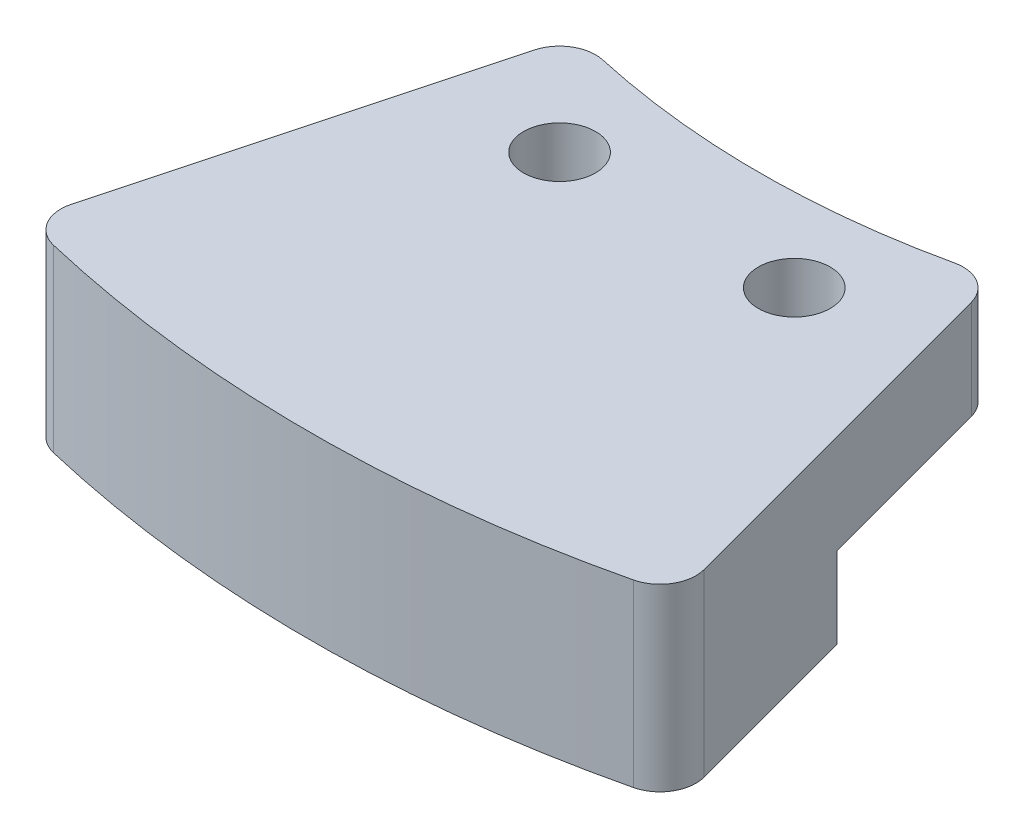
ISO-10303-21;
HEADER;
FILE_DESCRIPTION(('STEP AP214'),'2;1');
FILE_NAME('part.step','',(''),(''),'','','');
FILE_SCHEMA(('AUTOMOTIVE_DESIGN { 1 0 10303 214 1 1 1 1 }'));
ENDSEC;
DATA;
#1=APPLICATION_CONTEXT('core data for automotive mechanical design processes');
#2=APPLICATION_PROTOCOL_DEFINITION('international standard','automotive_design',2000,#1);
#3=PRODUCT_CONTEXT('',#1,'mechanical');
#4=PRODUCT('Part','Part','',(#3));
#5=PRODUCT_RELATED_PRODUCT_CATEGORY('part','',(#4));
#6=PRODUCT_DEFINITION_FORMATION('','',#4);
#7=PRODUCT_DEFINITION_CONTEXT('part definition',#1,'design');
#8=PRODUCT_DEFINITION('design','',#6,#7);
#9=PRODUCT_DEFINITION_SHAPE('','',#8);
#10=(LENGTH_UNIT() NAMED_UNIT(*) SI_UNIT(.MILLI.,.METRE.));
#11=(NAMED_UNIT(*) PLANE_ANGLE_UNIT() SI_UNIT($,.RADIAN.));
#12=(NAMED_UNIT(*) SI_UNIT($,.STERADIAN.) SOLID_ANGLE_UNIT());
#13=UNCERTAINTY_MEASURE_WITH_UNIT(LENGTH_MEASURE(1.E-05),#10,'distance_accuracy_value','');
#14=(GEOMETRIC_REPRESENTATION_CONTEXT(3) GLOBAL_UNCERTAINTY_ASSIGNED_CONTEXT((#13)) GLOBAL_UNIT_ASSIGNED_CONTEXT((#10,
#11,#12)) REPRESENTATION_CONTEXT('',''));
#15=CARTESIAN_POINT('',(0.,0.,0.));
#16=DIRECTION('',(0.,0.,1.));
#17=DIRECTION('',(1.,0.,0.));
#18=AXIS2_PLACEMENT_3D('',#15,#16,#17);
#19=CARTESIAN_POINT('',(0.,10.,0.));
#20=DIRECTION('',(0.,-1.,0.));
#21=DIRECTION('',(0.,0.,-1.));
#22=AXIS2_PLACEMENT_3D('',#19,#20,#21);
#23=CYLINDRICAL_SURFACE('',#22,45.);
#24=CARTESIAN_POINT('',(0.,4.5,0.));
#25=DIRECTION('',(0.,1.,0.));
#26=DIRECTION('',(0.,0.,-1.));
#27=AXIS2_PLACEMENT_3D('',#24,#25,#26);
#28=CIRCLE('',#27,45.);
#29=CARTESIAN_POINT('',(-9.78666213883321,4.5,43.9229011357439));
#30=VERTEX_POINT('',#29);
#31=CARTESIAN_POINT('',(9.78666213883322,4.5,43.9229011357439));
#32=VERTEX_POINT('',#31);
#33=EDGE_CURVE('E121',#30,#32,#28,.T.);
#34=ORIENTED_EDGE('',*,*,#33,.F.);
#35=DIRECTION('',(0.,-1.,0.));
#36=VECTOR('',#35,1.);
#37=CARTESIAN_POINT('',(-9.78666213883321,10.,43.9229011357439));
#38=LINE('',#37,#36);
#39=CARTESIAN_POINT('',(-9.78666213883321,10.,43.9229011357439));
#40=VERTEX_POINT('',#39);
#41=EDGE_CURVE('E182',#30,#40,#38,.F.);
#42=ORIENTED_EDGE('',*,*,#41,.T.);
#43=CARTESIAN_POINT('',(0.,10.,0.));
#44=DIRECTION('',(0.,-1.,0.));
#45=DIRECTION('',(0.,0.,1.));
#46=AXIS2_PLACEMENT_3D('',#43,#44,#45);
#47=CIRCLE('',#46,45.);
#48=CARTESIAN_POINT('',(9.78666213883322,10.,43.9229011357439));
#49=VERTEX_POINT('',#48);
#50=EDGE_CURVE('E159',#49,#40,#47,.T.);
#51=ORIENTED_EDGE('',*,*,#50,.F.);
#52=DIRECTION('',(0.,-1.,0.));
#53=VECTOR('',#52,1.);
#54=CARTESIAN_POINT('',(9.78666213883322,10.,43.9229011357439));
#55=LINE('',#54,#53);
#56=EDGE_CURVE('E179',#49,#32,#55,.T.);
#57=ORIENTED_EDGE('',*,*,#56,.T.);
#58=EDGE_LOOP('',(#34,#42,#51,#57));
#59=FACE_BOUND('',#58,.T.);
#60=ADVANCED_FACE('F33',(#59),#23,.F.);
#61=CARTESIAN_POINT('',(-6.52630961100259,10.,49.5722430686905));
#62=DIRECTION('',(0.,-1.,0.));
#63=DIRECTION('',(0.,0.,-1.));
#64=AXIS2_PLACEMENT_3D('',#61,#62,#63);
#65=CYLINDRICAL_SURFACE('',#64,2.);
#66=CARTESIAN_POINT('',(-6.52630961100259,10.,49.5722430686905));
#67=DIRECTION('',(0.,1.,0.));
#68=DIRECTION('',(0.,0.,1.));
#69=AXIS2_PLACEMENT_3D('',#66,#67,#68);
#70=CIRCLE('',#69,2.);
#71=CARTESIAN_POINT('',(-6.52630961100259,10.,51.5722430686905));
#72=VERTEX_POINT('',#71);
#73=EDGE_CURVE('E148',#72,#72,#70,.T.);
#74=ORIENTED_EDGE('',*,*,#73,.T.);
#75=EDGE_LOOP('',(#74));
#76=FACE_BOUND('',#75,.T.);
#77=CARTESIAN_POINT('',(-6.52630961100259,4.5,49.5722430686905));
#78=DIRECTION('',(0.,-1.,0.));
#79=DIRECTION('',(0.,0.,-1.));
#80=AXIS2_PLACEMENT_3D('',#77,#78,#79);
#81=CIRCLE('',#80,2.);
#82=CARTESIAN_POINT('',(-6.52630961100259,4.5,47.5722430686905));
#83=VERTEX_POINT('',#82);
#84=EDGE_CURVE('E142',#83,#83,#81,.T.);
#85=ORIENTED_EDGE('',*,*,#84,.T.);
#86=EDGE_LOOP('',(#85));
#87=FACE_BOUND('',#86,.T.);
#88=ADVANCED_FACE('F236',(#76,#87),#65,.F.);
#89=CARTESIAN_POINT('',(6.5263096110026,10.,49.5722430686905));
#90=DIRECTION('',(0.,-1.,0.));
#91=DIRECTION('',(0.,0.,-1.));
#92=AXIS2_PLACEMENT_3D('',#89,#90,#91);
#93=CYLINDRICAL_SURFACE('',#92,2.);
#94=CARTESIAN_POINT('',(6.5263096110026,10.,49.5722430686905));
#95=DIRECTION('',(0.,1.,0.));
#96=DIRECTION('',(0.,0.,-1.));
#97=AXIS2_PLACEMENT_3D('',#94,#95,#96);
#98=CIRCLE('',#97,2.);
#99=CARTESIAN_POINT('',(6.5263096110026,10.,47.5722430686905));
#100=VERTEX_POINT('',#99);
#101=EDGE_CURVE('E145',#100,#100,#98,.T.);
#102=ORIENTED_EDGE('',*,*,#101,.T.);
#103=EDGE_LOOP('',(#102));
#104=FACE_BOUND('',#103,.T.);
#105=CARTESIAN_POINT('',(6.5263096110026,4.5,49.5722430686905));
#106=DIRECTION('',(0.,-1.,0.));
#107=DIRECTION('',(0.,0.,-1.));
#108=AXIS2_PLACEMENT_3D('',#105,#106,#107);
#109=CIRCLE('',#108,2.);
#110=CARTESIAN_POINT('',(6.5263096110026,4.5,47.5722430686905));
#111=VERTEX_POINT('',#110);
#112=EDGE_CURVE('E137',#111,#111,#109,.T.);
#113=ORIENTED_EDGE('',*,*,#112,.T.);
#114=EDGE_LOOP('',(#113));
#115=FACE_BOUND('',#114,.T.);
#116=ADVANCED_FACE('F241',(#104,#115),#93,.F.);
#117=CARTESIAN_POINT('',(0.,10.,0.));
#118=DIRECTION('',(0.,1.,0.));
#119=DIRECTION('',(0.,0.,1.));
#120=AXIS2_PLACEMENT_3D('',#117,#118,#119);
#121=PLANE('',#120);
#122=ORIENTED_EDGE('',*,*,#73,.F.);
#123=EDGE_LOOP('',(#122));
#124=FACE_BOUND('',#123,.T.);
#125=ORIENTED_EDGE('',*,*,#50,.T.);
#126=CARTESIAN_POINT('',(-10.2216249005591,10.,45.8750300751103));
#127=DIRECTION('',(0.,1.,0.));
#128=DIRECTION('',(0.,0.,1.));
#129=AXIS2_PLACEMENT_3D('',#126,#127,#128);
#130=CIRCLE('',#129,2.);
#131=CARTESIAN_POINT('',(-12.1534765531373,10.,45.3573919849052));
#132=VERTEX_POINT('',#131);
#133=EDGE_CURVE('E190',#40,#132,#130,.T.);
#134=ORIENTED_EDGE('',*,*,#133,.T.);
#135=DIRECTION('',(-0.258819045102522,0.,0.965925826289068));
#136=VECTOR('',#135,1.);
#137=CARTESIAN_POINT('',(-11.6468570296135,10.,43.4666621830081));
#138=LINE('',#137,#136);
#139=CARTESIAN_POINT('',(-17.5920810951391,10.,65.6545404579307));
#140=VERTEX_POINT('',#139);
#141=EDGE_CURVE('E162',#132,#140,#138,.T.);
#142=ORIENTED_EDGE('',*,*,#141,.T.);
#143=CARTESIAN_POINT('',(-15.6602294425609,10.,66.1721785481357));
#144=DIRECTION('',(0.,1.,0.));
#145=DIRECTION('',(0.,0.,1.));
#146=AXIS2_PLACEMENT_3D('',#143,#144,#145);
#147=CIRCLE('',#146,2.);
#148=CARTESIAN_POINT('',(-16.1208244261656,10.,68.1184190936691));
#149=VERTEX_POINT('',#148);
#150=EDGE_CURVE('E184',#140,#149,#147,.T.);
#151=ORIENTED_EDGE('',*,*,#150,.T.);
#152=CARTESIAN_POINT('',(0.,10.,0.));
#153=DIRECTION('',(0.,1.,0.));
#154=DIRECTION('',(0.,0.,1.));
#155=AXIS2_PLACEMENT_3D('',#152,#153,#154);
#156=CIRCLE('',#155,70.);
#157=CARTESIAN_POINT('',(16.1208244261657,10.,68.1184190936691));
#158=VERTEX_POINT('',#157);
#159=EDGE_CURVE('E152',#149,#158,#156,.T.);
#160=ORIENTED_EDGE('',*,*,#159,.T.);
#161=CARTESIAN_POINT('',(15.6602294425609,10.,66.1721785481357));
#162=DIRECTION('',(0.,1.,0.));
#163=DIRECTION('',(0.,0.,1.));
#164=AXIS2_PLACEMENT_3D('',#161,#162,#163);
#165=CIRCLE('',#164,2.);
#166=CARTESIAN_POINT('',(17.5920810951391,10.,65.6545404579307));
#167=VERTEX_POINT('',#166);
#168=EDGE_CURVE('E186',#158,#167,#165,.T.);
#169=ORIENTED_EDGE('',*,*,#168,.T.);
#170=DIRECTION('',(-0.258819045102522,0.,-0.965925826289068));
#171=VECTOR('',#170,1.);
#172=CARTESIAN_POINT('',(11.6468570296135,10.,43.4666621830081));
#173=LINE('',#172,#171);
#174=CARTESIAN_POINT('',(12.1534765531373,10.,45.3573919849052));
#175=VERTEX_POINT('',#174);
#176=EDGE_CURVE('E155',#167,#175,#173,.T.);
#177=ORIENTED_EDGE('',*,*,#176,.T.);
#178=CARTESIAN_POINT('',(10.2216249005591,10.,45.8750300751103));
#179=DIRECTION('',(0.,1.,0.));
#180=DIRECTION('',(0.,0.,1.));
#181=AXIS2_PLACEMENT_3D('',#178,#179,#180);
#182=CIRCLE('',#181,2.);
#183=EDGE_CURVE('E188',#175,#49,#182,.T.);
#184=ORIENTED_EDGE('',*,*,#183,.T.);
#185=EDGE_LOOP('',(#125,#134,#142,#151,#160,#169,#177,#184));
#186=FACE_BOUND('',#185,.T.);
#187=ORIENTED_EDGE('',*,*,#101,.F.);
#188=EDGE_LOOP('',(#187));
#189=FACE_BOUND('',#188,.T.);
#190=ADVANCED_FACE('F208',(#124,#186,#189),#121,.T.);
#191=CARTESIAN_POINT('',(0.,0.,0.));
#192=DIRECTION('',(0.,1.,0.));
#193=DIRECTION('',(0.,0.,1.));
#194=AXIS2_PLACEMENT_3D('',#191,#192,#193);
#195=PLANE('',#194);
#196=DIRECTION('',(-0.258819045102522,0.,-0.965925826289068));
#197=VECTOR('',#196,1.);
#198=CARTESIAN_POINT('',(11.6468570296135,0.,43.4666621830081));
#199=LINE('',#198,#197);
#200=CARTESIAN_POINT('',(17.5920810951391,0.,65.6545404579307));
#201=VERTEX_POINT('',#200);
#202=CARTESIAN_POINT('',(14.882095093395,0.,55.5407350116214));
#203=VERTEX_POINT('',#202);
#204=EDGE_CURVE('E135',#201,#203,#199,.T.);
#205=ORIENTED_EDGE('',*,*,#204,.F.);
#206=CARTESIAN_POINT('',(15.6602294425609,0.,66.1721785481357));
#207=DIRECTION('',(0.,1.,0.));
#208=DIRECTION('',(0.,0.,1.));
#209=AXIS2_PLACEMENT_3D('',#206,#207,#208);
#210=CIRCLE('',#209,2.);
#211=CARTESIAN_POINT('',(16.1208244261657,0.,68.1184190936691));
#212=VERTEX_POINT('',#211);
#213=EDGE_CURVE('E48',#201,#212,#210,.F.);
#214=ORIENTED_EDGE('',*,*,#213,.T.);
#215=CARTESIAN_POINT('',(0.,0.,0.));
#216=DIRECTION('',(0.,1.,0.));
#217=DIRECTION('',(0.,0.,1.));
#218=AXIS2_PLACEMENT_3D('',#215,#216,#217);
#219=CIRCLE('',#218,70.);
#220=CARTESIAN_POINT('',(-16.1208244261656,0.,68.1184190936691));
#221=VERTEX_POINT('',#220);
#222=EDGE_CURVE('E151',#221,#212,#219,.T.);
#223=ORIENTED_EDGE('',*,*,#222,.F.);
#224=CARTESIAN_POINT('',(-15.6602294425609,0.,66.1721785481357));
#225=DIRECTION('',(0.,1.,0.));
#226=DIRECTION('',(0.,0.,1.));
#227=AXIS2_PLACEMENT_3D('',#224,#225,#226);
#228=CIRCLE('',#227,2.);
#229=CARTESIAN_POINT('',(-17.5920810951391,0.,65.6545404579307));
#230=VERTEX_POINT('',#229);
#231=EDGE_CURVE('E56',#221,#230,#228,.F.);
#232=ORIENTED_EDGE('',*,*,#231,.T.);
#233=DIRECTION('',(-0.258819045102522,0.,0.965925826289068));
#234=VECTOR('',#233,1.);
#235=CARTESIAN_POINT('',(-11.6468570296135,0.,43.4666621830081));
#236=LINE('',#235,#234);
#237=CARTESIAN_POINT('',(-14.882095093395,0.,55.5407350116214));
#238=VERTEX_POINT('',#237);
#239=EDGE_CURVE('E156',#238,#230,#236,.T.);
#240=ORIENTED_EDGE('',*,*,#239,.F.);
#241=CARTESIAN_POINT('',(0.,0.,0.));
#242=DIRECTION('',(0.,-1.,0.));
#243=DIRECTION('',(0.,0.,-1.));
#244=AXIS2_PLACEMENT_3D('',#241,#242,#243);
#245=CIRCLE('',#244,57.5);
#246=EDGE_CURVE('E220',#203,#238,#245,.T.);
#247=ORIENTED_EDGE('',*,*,#246,.F.);
#248=EDGE_LOOP('',(#205,#214,#223,#232,#240,#247));
#249=FACE_BOUND('',#248,.T.);
#250=ADVANCED_FACE('F202',(#249),#195,.F.);
#251=CARTESIAN_POINT('',(0.,10.,0.));
#252=DIRECTION('',(0.,-1.,0.));
#253=DIRECTION('',(0.,0.,-1.));
#254=AXIS2_PLACEMENT_3D('',#251,#252,#253);
#255=CYLINDRICAL_SURFACE('',#254,70.);
#256=ORIENTED_EDGE('',*,*,#222,.T.);
#257=DIRECTION('',(0.,-1.,0.));
#258=VECTOR('',#257,1.);
#259=CARTESIAN_POINT('',(16.1208244261657,10.,68.1184190936691));
#260=LINE('',#259,#258);
#261=EDGE_CURVE('E11',#212,#158,#260,.F.);
#262=ORIENTED_EDGE('',*,*,#261,.T.);
#263=ORIENTED_EDGE('',*,*,#159,.F.);
#264=DIRECTION('',(0.,-1.,0.));
#265=VECTOR('',#264,1.);
#266=CARTESIAN_POINT('',(-16.1208244261656,10.,68.1184190936691));
#267=LINE('',#266,#265);
#268=EDGE_CURVE('E41',#149,#221,#267,.T.);
#269=ORIENTED_EDGE('',*,*,#268,.T.);
#270=EDGE_LOOP('',(#256,#262,#263,#269));
#271=FACE_BOUND('',#270,.T.);
#272=ADVANCED_FACE('F199',(#271),#255,.T.);
#273=CARTESIAN_POINT('',(11.6468570296135,10.,43.4666621830081));
#274=DIRECTION('',(-0.965925826289068,0.,0.258819045102522));
#275=DIRECTION('',(0.258819045102522,0.,0.965925826289068));
#276=AXIS2_PLACEMENT_3D('',#273,#274,#275);
#277=PLANE('',#276);
#278=DIRECTION('',(0.258819045102522,0.,0.965925826289068));
#279=VECTOR('',#278,1.);
#280=CARTESIAN_POINT('',(14.882095093395,4.5,55.5407350116214));
#281=LINE('',#280,#279);
#282=CARTESIAN_POINT('',(12.1534765531373,4.5,45.3573919849052));
#283=VERTEX_POINT('',#282);
#284=CARTESIAN_POINT('',(14.882095093395,4.5,55.5407350116214));
#285=VERTEX_POINT('',#284);
#286=EDGE_CURVE('E110',#283,#285,#281,.T.);
#287=ORIENTED_EDGE('',*,*,#286,.F.);
#288=DIRECTION('',(0.,-1.,0.));
#289=VECTOR('',#288,1.);
#290=CARTESIAN_POINT('',(12.1534765531373,10.,45.3573919849052));
#291=LINE('',#290,#289);
#292=EDGE_CURVE('E194',#283,#175,#291,.F.);
#293=ORIENTED_EDGE('',*,*,#292,.T.);
#294=ORIENTED_EDGE('',*,*,#176,.F.);
#295=DIRECTION('',(0.,-1.,0.));
#296=VECTOR('',#295,1.);
#297=CARTESIAN_POINT('',(17.5920810951391,10.,65.6545404579307));
#298=LINE('',#297,#296);
#299=EDGE_CURVE('E192',#167,#201,#298,.T.);
#300=ORIENTED_EDGE('',*,*,#299,.T.);
#301=ORIENTED_EDGE('',*,*,#204,.T.);
#302=DIRECTION('',(0.,-1.,0.));
#303=VECTOR('',#302,1.);
#304=CARTESIAN_POINT('',(14.882095093395,4.5,55.5407350116214));
#305=LINE('',#304,#303);
#306=EDGE_CURVE('E126',#285,#203,#305,.T.);
#307=ORIENTED_EDGE('',*,*,#306,.F.);
#308=EDGE_LOOP('',(#287,#293,#294,#300,#301,#307));
#309=FACE_BOUND('',#308,.T.);
#310=ADVANCED_FACE('F133',(#309),#277,.F.);
#311=CARTESIAN_POINT('',(-11.6468570296135,10.,43.4666621830081));
#312=DIRECTION('',(0.965925826289068,0.,0.258819045102522));
#313=DIRECTION('',(0.258819045102522,0.,-0.965925826289068));
#314=AXIS2_PLACEMENT_3D('',#311,#312,#313);
#315=PLANE('',#314);
#316=ORIENTED_EDGE('',*,*,#141,.F.);
#317=DIRECTION('',(0.,-1.,0.));
#318=VECTOR('',#317,1.);
#319=CARTESIAN_POINT('',(-12.1534765531373,10.,45.3573919849052));
#320=LINE('',#319,#318);
#321=CARTESIAN_POINT('',(-12.1534765531373,4.5,45.3573919849052));
#322=VERTEX_POINT('',#321);
#323=EDGE_CURVE('E173',#132,#322,#320,.T.);
#324=ORIENTED_EDGE('',*,*,#323,.T.);
#325=DIRECTION('',(0.258819045102521,0.,-0.965925826289068));
#326=VECTOR('',#325,1.);
#327=CARTESIAN_POINT('',(-11.6468570296135,4.5,43.4666621830081));
#328=LINE('',#327,#326);
#329=CARTESIAN_POINT('',(-14.882095093395,4.5,55.5407350116214));
#330=VERTEX_POINT('',#329);
#331=EDGE_CURVE('E131',#330,#322,#328,.T.);
#332=ORIENTED_EDGE('',*,*,#331,.F.);
#333=DIRECTION('',(0.,-1.,0.));
#334=VECTOR('',#333,1.);
#335=CARTESIAN_POINT('',(-14.882095093395,4.5,55.5407350116214));
#336=LINE('',#335,#334);
#337=EDGE_CURVE('E129',#330,#238,#336,.T.);
#338=ORIENTED_EDGE('',*,*,#337,.T.);
#339=ORIENTED_EDGE('',*,*,#239,.T.);
#340=DIRECTION('',(0.,-1.,0.));
#341=VECTOR('',#340,1.);
#342=CARTESIAN_POINT('',(-17.5920810951391,10.,65.6545404579307));
#343=LINE('',#342,#341);
#344=EDGE_CURVE('E165',#230,#140,#343,.F.);
#345=ORIENTED_EDGE('',*,*,#344,.T.);
#346=EDGE_LOOP('',(#316,#324,#332,#338,#339,#345));
#347=FACE_BOUND('',#346,.T.);
#348=ADVANCED_FACE('F206',(#347),#315,.F.);
#349=CARTESIAN_POINT('',(0.,4.5,0.));
#350=DIRECTION('',(0.,-1.,0.));
#351=DIRECTION('',(0.,0.,-1.));
#352=AXIS2_PLACEMENT_3D('',#349,#350,#351);
#353=CYLINDRICAL_SURFACE('',#352,57.5);
#354=ORIENTED_EDGE('',*,*,#246,.T.);
#355=ORIENTED_EDGE('',*,*,#337,.F.);
#356=CARTESIAN_POINT('',(0.,4.5,0.));
#357=DIRECTION('',(0.,-1.,0.));
#358=DIRECTION('',(0.,0.,-1.));
#359=AXIS2_PLACEMENT_3D('',#356,#357,#358);
#360=CIRCLE('',#359,57.5);
#361=EDGE_CURVE('E114',#285,#330,#360,.T.);
#362=ORIENTED_EDGE('',*,*,#361,.F.);
#363=ORIENTED_EDGE('',*,*,#306,.T.);
#364=EDGE_LOOP('',(#354,#355,#362,#363));
#365=FACE_BOUND('',#364,.T.);
#366=ADVANCED_FACE('F125',(#365),#353,.F.);
#367=CARTESIAN_POINT('',(0.,4.5,0.));
#368=DIRECTION('',(0.,-1.,0.));
#369=DIRECTION('',(0.,0.,-1.));
#370=AXIS2_PLACEMENT_3D('',#367,#368,#369);
#371=PLANE('',#370);
#372=ORIENTED_EDGE('',*,*,#84,.F.);
#373=EDGE_LOOP('',(#372));
#374=FACE_BOUND('',#373,.T.);
#375=ORIENTED_EDGE('',*,*,#112,.F.);
#376=EDGE_LOOP('',(#375));
#377=FACE_BOUND('',#376,.T.);
#378=ORIENTED_EDGE('',*,*,#331,.T.);
#379=CARTESIAN_POINT('',(-10.2216249005591,4.5,45.8750300751103));
#380=DIRECTION('',(0.,-1.,0.));
#381=DIRECTION('',(0.,0.,-1.));
#382=AXIS2_PLACEMENT_3D('',#379,#380,#381);
#383=CIRCLE('',#382,2.);
#384=EDGE_CURVE('E177',#322,#30,#383,.T.);
#385=ORIENTED_EDGE('',*,*,#384,.T.);
#386=ORIENTED_EDGE('',*,*,#33,.T.);
#387=CARTESIAN_POINT('',(10.2216249005591,4.5,45.8750300751103));
#388=DIRECTION('',(0.,-1.,0.));
#389=DIRECTION('',(0.,0.,-1.));
#390=AXIS2_PLACEMENT_3D('',#387,#388,#389);
#391=CIRCLE('',#390,2.);
#392=EDGE_CURVE('E117',#32,#283,#391,.T.);
#393=ORIENTED_EDGE('',*,*,#392,.T.);
#394=ORIENTED_EDGE('',*,*,#286,.T.);
#395=ORIENTED_EDGE('',*,*,#361,.T.);
#396=EDGE_LOOP('',(#378,#385,#386,#393,#394,#395));
#397=FACE_BOUND('',#396,.T.);
#398=ADVANCED_FACE('F113',(#374,#377,#397),#371,.T.);
#399=CARTESIAN_POINT('',(-10.2216249005591,10.,45.8750300751103));
#400=DIRECTION('',(0.,-1.,0.));
#401=DIRECTION('',(0.,0.,-1.));
#402=AXIS2_PLACEMENT_3D('',#399,#400,#401);
#403=CYLINDRICAL_SURFACE('',#402,2.);
#404=ORIENTED_EDGE('',*,*,#133,.F.);
#405=ORIENTED_EDGE('',*,*,#41,.F.);
#406=ORIENTED_EDGE('',*,*,#384,.F.);
#407=ORIENTED_EDGE('',*,*,#323,.F.);
#408=EDGE_LOOP('',(#404,#405,#406,#407));
#409=FACE_BOUND('',#408,.T.);
#410=ADVANCED_FACE('F214',(#409),#403,.T.);
#411=CARTESIAN_POINT('',(10.2216249005591,10.,45.8750300751103));
#412=DIRECTION('',(0.,-1.,0.));
#413=DIRECTION('',(0.,0.,-1.));
#414=AXIS2_PLACEMENT_3D('',#411,#412,#413);
#415=CYLINDRICAL_SURFACE('',#414,2.);
#416=ORIENTED_EDGE('',*,*,#183,.F.);
#417=ORIENTED_EDGE('',*,*,#292,.F.);
#418=ORIENTED_EDGE('',*,*,#392,.F.);
#419=ORIENTED_EDGE('',*,*,#56,.F.);
#420=EDGE_LOOP('',(#416,#417,#418,#419));
#421=FACE_BOUND('',#420,.T.);
#422=ADVANCED_FACE('F224',(#421),#415,.T.);
#423=CARTESIAN_POINT('',(15.6602294425609,10.,66.1721785481357));
#424=DIRECTION('',(0.,-1.,0.));
#425=DIRECTION('',(0.,0.,-1.));
#426=AXIS2_PLACEMENT_3D('',#423,#424,#425);
#427=CYLINDRICAL_SURFACE('',#426,2.);
#428=ORIENTED_EDGE('',*,*,#168,.F.);
#429=ORIENTED_EDGE('',*,*,#261,.F.);
#430=ORIENTED_EDGE('',*,*,#213,.F.);
#431=ORIENTED_EDGE('',*,*,#299,.F.);
#432=EDGE_LOOP('',(#428,#429,#430,#431));
#433=FACE_BOUND('',#432,.T.);
#434=ADVANCED_FACE('F228',(#433),#427,.T.);
#435=CARTESIAN_POINT('',(-15.6602294425609,10.,66.1721785481357));
#436=DIRECTION('',(0.,-1.,0.));
#437=DIRECTION('',(0.,0.,-1.));
#438=AXIS2_PLACEMENT_3D('',#435,#436,#437);
#439=CYLINDRICAL_SURFACE('',#438,2.);
#440=ORIENTED_EDGE('',*,*,#150,.F.);
#441=ORIENTED_EDGE('',*,*,#344,.F.);
#442=ORIENTED_EDGE('',*,*,#231,.F.);
#443=ORIENTED_EDGE('',*,*,#268,.F.);
#444=EDGE_LOOP('',(#440,#441,#442,#443));
#445=FACE_BOUND('',#444,.T.);
#446=ADVANCED_FACE('F35',(#445),#439,.T.);
#447=CLOSED_SHELL('',(#60,#88,#116,#190,#250,#272,#310,#348,#366,#398,#410,#422,#434,#446));
#448=MANIFOLD_SOLID_BREP('B2',#447);
#449=ADVANCED_BREP_SHAPE_REPRESENTATION('',(#18,#448),#14);
#450=SHAPE_DEFINITION_REPRESENTATION(#9,#449);
ENDSEC;
END-ISO-10303-21;
